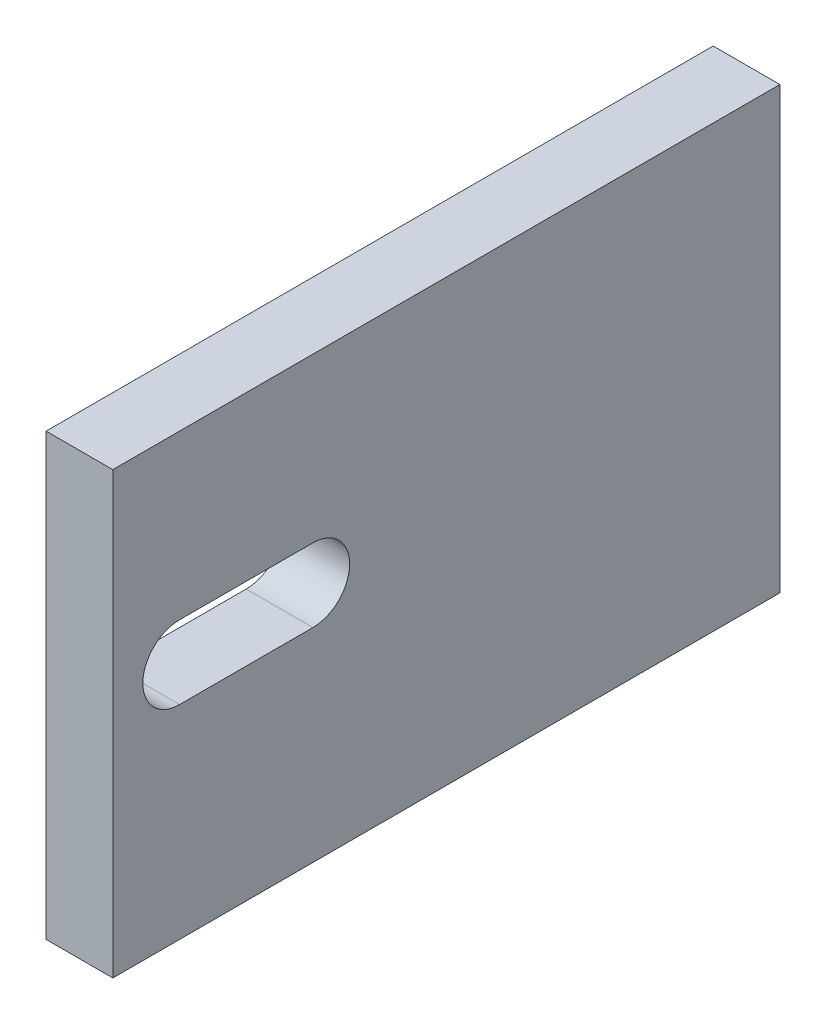
ISO-10303-21;
HEADER;
FILE_DESCRIPTION(('STEP AP214'),'2;1');
FILE_NAME('part.step','',(''),(''),'','','');
FILE_SCHEMA(('AUTOMOTIVE_DESIGN { 1 0 10303 214 1 1 1 1 }'));
ENDSEC;
DATA;
#1=APPLICATION_CONTEXT('core data for automotive mechanical design processes');
#2=APPLICATION_PROTOCOL_DEFINITION('international standard','automotive_design',2000,#1);
#3=PRODUCT_CONTEXT('',#1,'mechanical');
#4=PRODUCT('Part','Part','',(#3));
#5=PRODUCT_RELATED_PRODUCT_CATEGORY('part','',(#4));
#6=PRODUCT_DEFINITION_FORMATION('','',#4);
#7=PRODUCT_DEFINITION_CONTEXT('part definition',#1,'design');
#8=PRODUCT_DEFINITION('design','',#6,#7);
#9=PRODUCT_DEFINITION_SHAPE('','',#8);
#10=(LENGTH_UNIT() NAMED_UNIT(*) SI_UNIT(.MILLI.,.METRE.));
#11=(NAMED_UNIT(*) PLANE_ANGLE_UNIT() SI_UNIT($,.RADIAN.));
#12=(NAMED_UNIT(*) SI_UNIT($,.STERADIAN.) SOLID_ANGLE_UNIT());
#13=UNCERTAINTY_MEASURE_WITH_UNIT(LENGTH_MEASURE(1.E-05),#10,'distance_accuracy_value','');
#14=(GEOMETRIC_REPRESENTATION_CONTEXT(3) GLOBAL_UNCERTAINTY_ASSIGNED_CONTEXT((#13)) GLOBAL_UNIT_ASSIGNED_CONTEXT((#10,
#11,#12)) REPRESENTATION_CONTEXT('',''));
#15=CARTESIAN_POINT('',(0.,0.,0.));
#16=DIRECTION('',(0.,0.,1.));
#17=DIRECTION('',(1.,0.,0.));
#18=AXIS2_PLACEMENT_3D('',#15,#16,#17);
#19=CARTESIAN_POINT('',(5.,16.5,-25.));
#20=DIRECTION('',(-1.,0.,0.));
#21=DIRECTION('',(0.,0.,1.));
#22=AXIS2_PLACEMENT_3D('',#19,#20,#21);
#23=PLANE('',#22);
#24=DIRECTION('',(0.,1.,0.));
#25=VECTOR('',#24,1.);
#26=CARTESIAN_POINT('',(5.,-16.5,-25.));
#27=LINE('',#26,#25);
#28=CARTESIAN_POINT('',(5.,-16.5,-25.));
#29=VERTEX_POINT('',#28);
#30=CARTESIAN_POINT('',(5.,16.5,-25.));
#31=VERTEX_POINT('',#30);
#32=EDGE_CURVE('E132',#29,#31,#27,.T.);
#33=ORIENTED_EDGE('',*,*,#32,.T.);
#34=DIRECTION('',(0.,0.,1.));
#35=VECTOR('',#34,1.);
#36=CARTESIAN_POINT('',(5.,16.5,25.));
#37=LINE('',#36,#35);
#38=CARTESIAN_POINT('',(5.,16.5,25.));
#39=VERTEX_POINT('',#38);
#40=EDGE_CURVE('E135',#31,#39,#37,.T.);
#41=ORIENTED_EDGE('',*,*,#40,.T.);
#42=DIRECTION('',(0.,-1.,0.));
#43=VECTOR('',#42,1.);
#44=CARTESIAN_POINT('',(5.,-16.5,25.));
#45=LINE('',#44,#43);
#46=CARTESIAN_POINT('',(5.,-16.5,25.));
#47=VERTEX_POINT('',#46);
#48=EDGE_CURVE('E138',#39,#47,#45,.T.);
#49=ORIENTED_EDGE('',*,*,#48,.T.);
#50=DIRECTION('',(0.,0.,-1.));
#51=VECTOR('',#50,1.);
#52=CARTESIAN_POINT('',(5.,-16.5,25.));
#53=LINE('',#52,#51);
#54=EDGE_CURVE('E140',#47,#29,#53,.T.);
#55=ORIENTED_EDGE('',*,*,#54,.T.);
#56=EDGE_LOOP('',(#33,#41,#49,#55));
#57=FACE_BOUND('',#56,.T.);
#58=CARTESIAN_POINT('',(5.,1.5,20.));
#59=DIRECTION('',(1.,0.,0.));
#60=DIRECTION('',(0.,0.,-1.));
#61=AXIS2_PLACEMENT_3D('',#58,#59,#60);
#62=CIRCLE('',#61,2.75);
#63=CARTESIAN_POINT('',(5.,4.25,20.));
#64=VERTEX_POINT('',#63);
#65=CARTESIAN_POINT('',(5.,-1.25,20.));
#66=VERTEX_POINT('',#65);
#67=EDGE_CURVE('E96',#64,#66,#62,.T.);
#68=ORIENTED_EDGE('',*,*,#67,.F.);
#69=DIRECTION('',(0.,0.,1.));
#70=VECTOR('',#69,1.);
#71=CARTESIAN_POINT('',(5.,4.25,20.));
#72=LINE('',#71,#70);
#73=CARTESIAN_POINT('',(5.,4.25,10.));
#74=VERTEX_POINT('',#73);
#75=EDGE_CURVE('E118',#74,#64,#72,.T.);
#76=ORIENTED_EDGE('',*,*,#75,.F.);
#77=CARTESIAN_POINT('',(5.,1.5,10.));
#78=DIRECTION('',(1.,0.,0.));
#79=DIRECTION('',(0.,0.,-1.));
#80=AXIS2_PLACEMENT_3D('',#77,#78,#79);
#81=CIRCLE('',#80,2.75);
#82=CARTESIAN_POINT('',(5.,-1.25,10.));
#83=VERTEX_POINT('',#82);
#84=EDGE_CURVE('E116',#83,#74,#81,.T.);
#85=ORIENTED_EDGE('',*,*,#84,.F.);
#86=DIRECTION('',(0.,0.,-1.));
#87=VECTOR('',#86,1.);
#88=CARTESIAN_POINT('',(5.,-1.25,20.));
#89=LINE('',#88,#87);
#90=EDGE_CURVE('E104',#66,#83,#89,.T.);
#91=ORIENTED_EDGE('',*,*,#90,.F.);
#92=EDGE_LOOP('',(#68,#76,#85,#91));
#93=FACE_BOUND('',#92,.T.);
#94=ADVANCED_FACE('F31',(#57,#93),#23,.F.);
#95=CARTESIAN_POINT('',(0.,16.5,-25.));
#96=DIRECTION('',(-1.,0.,0.));
#97=DIRECTION('',(0.,0.,1.));
#98=AXIS2_PLACEMENT_3D('',#95,#96,#97);
#99=PLANE('',#98);
#100=DIRECTION('',(0.,1.,0.));
#101=VECTOR('',#100,1.);
#102=CARTESIAN_POINT('',(0.,-16.5,-25.));
#103=LINE('',#102,#101);
#104=CARTESIAN_POINT('',(0.,-16.5,-25.));
#105=VERTEX_POINT('',#104);
#106=CARTESIAN_POINT('',(0.,16.5,-25.));
#107=VERTEX_POINT('',#106);
#108=EDGE_CURVE('E112',#105,#107,#103,.T.);
#109=ORIENTED_EDGE('',*,*,#108,.F.);
#110=DIRECTION('',(0.,0.,-1.));
#111=VECTOR('',#110,1.);
#112=CARTESIAN_POINT('',(0.,-16.5,25.));
#113=LINE('',#112,#111);
#114=CARTESIAN_POINT('',(0.,-16.5,25.));
#115=VERTEX_POINT('',#114);
#116=EDGE_CURVE('E136',#115,#105,#113,.T.);
#117=ORIENTED_EDGE('',*,*,#116,.F.);
#118=DIRECTION('',(0.,-1.,0.));
#119=VECTOR('',#118,1.);
#120=CARTESIAN_POINT('',(0.,-16.5,25.));
#121=LINE('',#120,#119);
#122=CARTESIAN_POINT('',(0.,16.5,25.));
#123=VERTEX_POINT('',#122);
#124=EDGE_CURVE('E147',#123,#115,#121,.T.);
#125=ORIENTED_EDGE('',*,*,#124,.F.);
#126=DIRECTION('',(0.,0.,1.));
#127=VECTOR('',#126,1.);
#128=CARTESIAN_POINT('',(0.,16.5,25.));
#129=LINE('',#128,#127);
#130=EDGE_CURVE('E145',#107,#123,#129,.T.);
#131=ORIENTED_EDGE('',*,*,#130,.F.);
#132=EDGE_LOOP('',(#109,#117,#125,#131));
#133=FACE_BOUND('',#132,.T.);
#134=DIRECTION('',(0.,0.,1.));
#135=VECTOR('',#134,1.);
#136=CARTESIAN_POINT('',(0.,4.25,20.));
#137=LINE('',#136,#135);
#138=CARTESIAN_POINT('',(0.,4.25,10.));
#139=VERTEX_POINT('',#138);
#140=CARTESIAN_POINT('',(0.,4.25,20.));
#141=VERTEX_POINT('',#140);
#142=EDGE_CURVE('E105',#139,#141,#137,.T.);
#143=ORIENTED_EDGE('',*,*,#142,.T.);
#144=CARTESIAN_POINT('',(0.,1.5,20.));
#145=DIRECTION('',(1.,0.,0.));
#146=DIRECTION('',(0.,0.,-1.));
#147=AXIS2_PLACEMENT_3D('',#144,#145,#146);
#148=CIRCLE('',#147,2.75);
#149=CARTESIAN_POINT('',(0.,-1.25,20.));
#150=VERTEX_POINT('',#149);
#151=EDGE_CURVE('E54',#141,#150,#148,.T.);
#152=ORIENTED_EDGE('',*,*,#151,.T.);
#153=DIRECTION('',(0.,0.,-1.));
#154=VECTOR('',#153,1.);
#155=CARTESIAN_POINT('',(0.,-1.25,20.));
#156=LINE('',#155,#154);
#157=CARTESIAN_POINT('',(0.,-1.25,10.));
#158=VERTEX_POINT('',#157);
#159=EDGE_CURVE('E111',#150,#158,#156,.T.);
#160=ORIENTED_EDGE('',*,*,#159,.T.);
#161=CARTESIAN_POINT('',(0.,1.5,10.));
#162=DIRECTION('',(1.,0.,0.));
#163=DIRECTION('',(0.,0.,-1.));
#164=AXIS2_PLACEMENT_3D('',#161,#162,#163);
#165=CIRCLE('',#164,2.75);
#166=EDGE_CURVE('E124',#158,#139,#165,.T.);
#167=ORIENTED_EDGE('',*,*,#166,.T.);
#168=EDGE_LOOP('',(#143,#152,#160,#167));
#169=FACE_BOUND('',#168,.T.);
#170=ADVANCED_FACE('F165',(#133,#169),#99,.T.);
#171=CARTESIAN_POINT('',(5.,-16.5,-25.));
#172=DIRECTION('',(0.,0.,1.));
#173=DIRECTION('',(1.,0.,0.));
#174=AXIS2_PLACEMENT_3D('',#171,#172,#173);
#175=PLANE('',#174);
#176=ORIENTED_EDGE('',*,*,#108,.T.);
#177=DIRECTION('',(-1.,0.,0.));
#178=VECTOR('',#177,1.);
#179=CARTESIAN_POINT('',(5.,16.5,-25.));
#180=LINE('',#179,#178);
#181=EDGE_CURVE('E11',#31,#107,#180,.T.);
#182=ORIENTED_EDGE('',*,*,#181,.F.);
#183=ORIENTED_EDGE('',*,*,#32,.F.);
#184=DIRECTION('',(-1.,0.,0.));
#185=VECTOR('',#184,1.);
#186=CARTESIAN_POINT('',(5.,-16.5,-25.));
#187=LINE('',#186,#185);
#188=EDGE_CURVE('E142',#29,#105,#187,.T.);
#189=ORIENTED_EDGE('',*,*,#188,.T.);
#190=EDGE_LOOP('',(#176,#182,#183,#189));
#191=FACE_BOUND('',#190,.T.);
#192=ADVANCED_FACE('F33',(#191),#175,.F.);
#193=CARTESIAN_POINT('',(5.,16.5,25.));
#194=DIRECTION('',(0.,-1.,0.));
#195=DIRECTION('',(0.,0.,-1.));
#196=AXIS2_PLACEMENT_3D('',#193,#194,#195);
#197=PLANE('',#196);
#198=ORIENTED_EDGE('',*,*,#130,.T.);
#199=DIRECTION('',(-1.,0.,0.));
#200=VECTOR('',#199,1.);
#201=CARTESIAN_POINT('',(5.,16.5,25.));
#202=LINE('',#201,#200);
#203=EDGE_CURVE('E39',#39,#123,#202,.T.);
#204=ORIENTED_EDGE('',*,*,#203,.F.);
#205=ORIENTED_EDGE('',*,*,#40,.F.);
#206=ORIENTED_EDGE('',*,*,#181,.T.);
#207=EDGE_LOOP('',(#198,#204,#205,#206));
#208=FACE_BOUND('',#207,.T.);
#209=ADVANCED_FACE('F175',(#208),#197,.F.);
#210=CARTESIAN_POINT('',(5.,-16.5,25.));
#211=DIRECTION('',(0.,0.,-1.));
#212=DIRECTION('',(-1.,0.,0.));
#213=AXIS2_PLACEMENT_3D('',#210,#211,#212);
#214=PLANE('',#213);
#215=ORIENTED_EDGE('',*,*,#124,.T.);
#216=DIRECTION('',(-1.,0.,0.));
#217=VECTOR('',#216,1.);
#218=CARTESIAN_POINT('',(5.,-16.5,25.));
#219=LINE('',#218,#217);
#220=EDGE_CURVE('E152',#47,#115,#219,.T.);
#221=ORIENTED_EDGE('',*,*,#220,.F.);
#222=ORIENTED_EDGE('',*,*,#48,.F.);
#223=ORIENTED_EDGE('',*,*,#203,.T.);
#224=EDGE_LOOP('',(#215,#221,#222,#223));
#225=FACE_BOUND('',#224,.T.);
#226=ADVANCED_FACE('F159',(#225),#214,.F.);
#227=CARTESIAN_POINT('',(5.,-16.5,25.));
#228=DIRECTION('',(0.,1.,0.));
#229=DIRECTION('',(0.,0.,1.));
#230=AXIS2_PLACEMENT_3D('',#227,#228,#229);
#231=PLANE('',#230);
#232=ORIENTED_EDGE('',*,*,#116,.T.);
#233=ORIENTED_EDGE('',*,*,#188,.F.);
#234=ORIENTED_EDGE('',*,*,#54,.F.);
#235=ORIENTED_EDGE('',*,*,#220,.T.);
#236=EDGE_LOOP('',(#232,#233,#234,#235));
#237=FACE_BOUND('',#236,.T.);
#238=ADVANCED_FACE('F169',(#237),#231,.F.);
#239=CARTESIAN_POINT('',(5.,1.5,20.));
#240=DIRECTION('',(-1.,0.,0.));
#241=DIRECTION('',(0.,0.,1.));
#242=AXIS2_PLACEMENT_3D('',#239,#240,#241);
#243=CYLINDRICAL_SURFACE('',#242,2.75);
#244=ORIENTED_EDGE('',*,*,#151,.F.);
#245=DIRECTION('',(-1.,0.,0.));
#246=VECTOR('',#245,1.);
#247=CARTESIAN_POINT('',(5.,4.25,20.));
#248=LINE('',#247,#246);
#249=EDGE_CURVE('E100',#64,#141,#248,.T.);
#250=ORIENTED_EDGE('',*,*,#249,.F.);
#251=ORIENTED_EDGE('',*,*,#67,.T.);
#252=DIRECTION('',(-1.,0.,0.));
#253=VECTOR('',#252,1.);
#254=CARTESIAN_POINT('',(5.,-1.25,20.));
#255=LINE('',#254,#253);
#256=EDGE_CURVE('E99',#66,#150,#255,.T.);
#257=ORIENTED_EDGE('',*,*,#256,.T.);
#258=EDGE_LOOP('',(#244,#250,#251,#257));
#259=FACE_BOUND('',#258,.T.);
#260=ADVANCED_FACE('F98',(#259),#243,.F.);
#261=CARTESIAN_POINT('',(5.,-1.25,20.));
#262=DIRECTION('',(0.,1.,0.));
#263=DIRECTION('',(0.,0.,1.));
#264=AXIS2_PLACEMENT_3D('',#261,#262,#263);
#265=PLANE('',#264);
#266=ORIENTED_EDGE('',*,*,#159,.F.);
#267=ORIENTED_EDGE('',*,*,#256,.F.);
#268=ORIENTED_EDGE('',*,*,#90,.T.);
#269=DIRECTION('',(-1.,0.,0.));
#270=VECTOR('',#269,1.);
#271=CARTESIAN_POINT('',(5.,-1.25,10.));
#272=LINE('',#271,#270);
#273=EDGE_CURVE('E113',#83,#158,#272,.T.);
#274=ORIENTED_EDGE('',*,*,#273,.T.);
#275=EDGE_LOOP('',(#266,#267,#268,#274));
#276=FACE_BOUND('',#275,.T.);
#277=ADVANCED_FACE('F108',(#276),#265,.T.);
#278=CARTESIAN_POINT('',(5.,1.5,10.));
#279=DIRECTION('',(-1.,0.,0.));
#280=DIRECTION('',(0.,0.,1.));
#281=AXIS2_PLACEMENT_3D('',#278,#279,#280);
#282=CYLINDRICAL_SURFACE('',#281,2.75);
#283=ORIENTED_EDGE('',*,*,#166,.F.);
#284=ORIENTED_EDGE('',*,*,#273,.F.);
#285=ORIENTED_EDGE('',*,*,#84,.T.);
#286=DIRECTION('',(-1.,0.,0.));
#287=VECTOR('',#286,1.);
#288=CARTESIAN_POINT('',(5.,4.25,10.));
#289=LINE('',#288,#287);
#290=EDGE_CURVE('E46',#74,#139,#289,.T.);
#291=ORIENTED_EDGE('',*,*,#290,.T.);
#292=EDGE_LOOP('',(#283,#284,#285,#291));
#293=FACE_BOUND('',#292,.T.);
#294=ADVANCED_FACE('F198',(#293),#282,.F.);
#295=CARTESIAN_POINT('',(5.,4.25,20.));
#296=DIRECTION('',(0.,-1.,0.));
#297=DIRECTION('',(0.,0.,-1.));
#298=AXIS2_PLACEMENT_3D('',#295,#296,#297);
#299=PLANE('',#298);
#300=ORIENTED_EDGE('',*,*,#142,.F.);
#301=ORIENTED_EDGE('',*,*,#290,.F.);
#302=ORIENTED_EDGE('',*,*,#75,.T.);
#303=ORIENTED_EDGE('',*,*,#249,.T.);
#304=EDGE_LOOP('',(#300,#301,#302,#303));
#305=FACE_BOUND('',#304,.T.);
#306=ADVANCED_FACE('F202',(#305),#299,.T.);
#307=CLOSED_SHELL('',(#94,#170,#192,#209,#226,#238,#260,#277,#294,#306));
#308=MANIFOLD_SOLID_BREP('B2',#307);
#309=ADVANCED_BREP_SHAPE_REPRESENTATION('',(#18,#308),#14);
#310=SHAPE_DEFINITION_REPRESENTATION(#9,#309);
ENDSEC;
END-ISO-10303-21;
